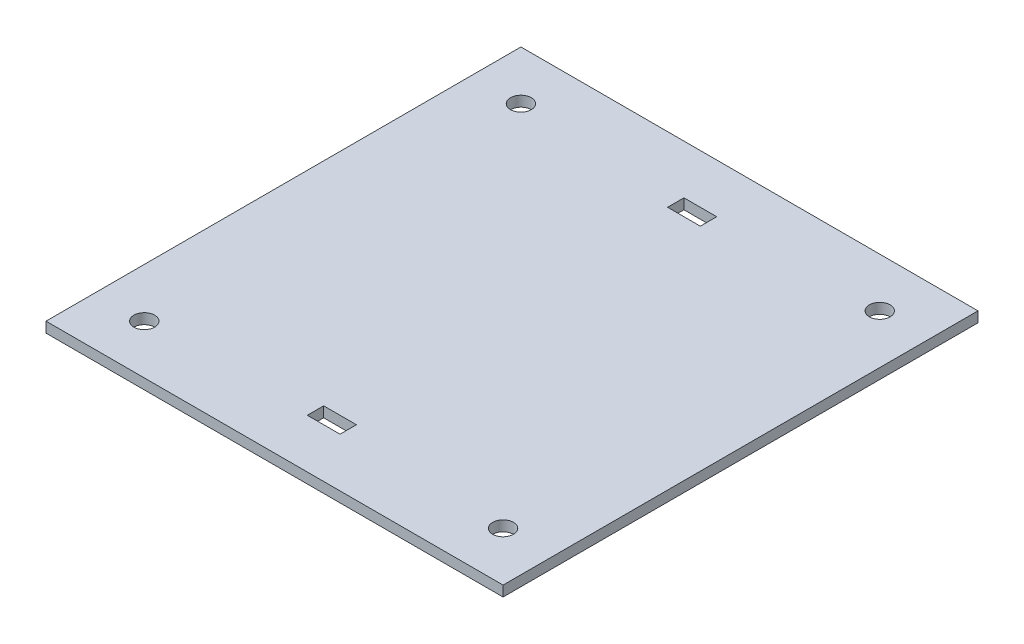
ISO-10303-21;
HEADER;
FILE_DESCRIPTION(('STEP AP214'),'2;1');
FILE_NAME('part.step','',(''),(''),'','','');
FILE_SCHEMA(('AUTOMOTIVE_DESIGN { 1 0 10303 214 1 1 1 1 }'));
ENDSEC;
DATA;
#1=APPLICATION_CONTEXT('core data for automotive mechanical design processes');
#2=APPLICATION_PROTOCOL_DEFINITION('international standard','automotive_design',2000,#1);
#3=PRODUCT_CONTEXT('',#1,'mechanical');
#4=PRODUCT('Part','Part','',(#3));
#5=PRODUCT_RELATED_PRODUCT_CATEGORY('part','',(#4));
#6=PRODUCT_DEFINITION_FORMATION('','',#4);
#7=PRODUCT_DEFINITION_CONTEXT('part definition',#1,'design');
#8=PRODUCT_DEFINITION('design','',#6,#7);
#9=PRODUCT_DEFINITION_SHAPE('','',#8);
#10=(LENGTH_UNIT() NAMED_UNIT(*) SI_UNIT(.MILLI.,.METRE.));
#11=(NAMED_UNIT(*) PLANE_ANGLE_UNIT() SI_UNIT($,.RADIAN.));
#12=(NAMED_UNIT(*) SI_UNIT($,.STERADIAN.) SOLID_ANGLE_UNIT());
#13=UNCERTAINTY_MEASURE_WITH_UNIT(LENGTH_MEASURE(1.E-05),#10,'distance_accuracy_value','');
#14=(GEOMETRIC_REPRESENTATION_CONTEXT(3) GLOBAL_UNCERTAINTY_ASSIGNED_CONTEXT((#13)) GLOBAL_UNIT_ASSIGNED_CONTEXT((#10,
#11,#12)) REPRESENTATION_CONTEXT('',''));
#15=CARTESIAN_POINT('',(0.,0.,0.));
#16=DIRECTION('',(0.,0.,1.));
#17=DIRECTION('',(1.,0.,0.));
#18=AXIS2_PLACEMENT_3D('',#15,#16,#17);
#19=CARTESIAN_POINT('',(0.,3.175,0.));
#20=DIRECTION('',(0.,1.,0.));
#21=DIRECTION('',(0.,0.,1.));
#22=AXIS2_PLACEMENT_3D('',#19,#20,#21);
#23=PLANE('',#22);
#24=CARTESIAN_POINT('',(124.55,3.175,-15.));
#25=DIRECTION('',(0.,1.,0.));
#26=DIRECTION('',(0.,0.,1.));
#27=AXIS2_PLACEMENT_3D('',#24,#25,#26);
#28=CIRCLE('',#27,3.175);
#29=CARTESIAN_POINT('',(124.55,3.175,-11.825));
#30=VERTEX_POINT('',#29);
#31=EDGE_CURVE('E271',#30,#30,#28,.T.);
#32=ORIENTED_EDGE('',*,*,#31,.F.);
#33=EDGE_LOOP('',(#32));
#34=FACE_BOUND('',#33,.T.);
#35=CARTESIAN_POINT('',(124.55,3.175,-130.));
#36=DIRECTION('',(0.,-1.,0.));
#37=DIRECTION('',(0.,0.,-1.));
#38=AXIS2_PLACEMENT_3D('',#35,#36,#37);
#39=CIRCLE('',#38,3.175);
#40=CARTESIAN_POINT('',(124.55,3.175,-133.175));
#41=VERTEX_POINT('',#40);
#42=EDGE_CURVE('E277',#41,#41,#39,.T.);
#43=ORIENTED_EDGE('',*,*,#42,.T.);
#44=EDGE_LOOP('',(#43));
#45=FACE_BOUND('',#44,.T.);
#46=DIRECTION('',(1.,0.,0.));
#47=VECTOR('',#46,1.);
#48=CARTESIAN_POINT('',(0.,3.175,0.));
#49=LINE('',#48,#47);
#50=CARTESIAN_POINT('',(0.,3.175,0.));
#51=VERTEX_POINT('',#50);
#52=CARTESIAN_POINT('',(139.55,3.175,0.));
#53=VERTEX_POINT('',#52);
#54=EDGE_CURVE('E315',#51,#53,#49,.T.);
#55=ORIENTED_EDGE('',*,*,#54,.T.);
#56=DIRECTION('',(0.,0.,-1.));
#57=VECTOR('',#56,1.);
#58=CARTESIAN_POINT('',(139.55,3.175,0.));
#59=LINE('',#58,#57);
#60=CARTESIAN_POINT('',(139.55,3.175,-145.));
#61=VERTEX_POINT('',#60);
#62=EDGE_CURVE('E318',#53,#61,#59,.T.);
#63=ORIENTED_EDGE('',*,*,#62,.T.);
#64=DIRECTION('',(1.,0.,0.));
#65=VECTOR('',#64,1.);
#66=CARTESIAN_POINT('',(0.,3.175,-145.));
#67=LINE('',#66,#65);
#68=CARTESIAN_POINT('',(0.,3.175,-145.));
#69=VERTEX_POINT('',#68);
#70=EDGE_CURVE('E321',#69,#61,#67,.T.);
#71=ORIENTED_EDGE('',*,*,#70,.F.);
#72=DIRECTION('',(0.,0.,-1.));
#73=VECTOR('',#72,1.);
#74=CARTESIAN_POINT('',(0.,3.175,0.));
#75=LINE('',#74,#73);
#76=EDGE_CURVE('E324',#51,#69,#75,.T.);
#77=ORIENTED_EDGE('',*,*,#76,.F.);
#78=EDGE_LOOP('',(#55,#63,#71,#77));
#79=FACE_BOUND('',#78,.T.);
#80=DIRECTION('',(1.,0.,0.));
#81=VECTOR('',#80,1.);
#82=CARTESIAN_POINT('',(64.775,3.175,-125.));
#83=LINE('',#82,#81);
#84=CARTESIAN_POINT('',(64.775,3.175,-125.));
#85=VERTEX_POINT('',#84);
#86=CARTESIAN_POINT('',(74.775,3.175,-125.));
#87=VERTEX_POINT('',#86);
#88=EDGE_CURVE('E285',#85,#87,#83,.T.);
#89=ORIENTED_EDGE('',*,*,#88,.F.);
#90=DIRECTION('',(0.,0.,1.));
#91=VECTOR('',#90,1.);
#92=CARTESIAN_POINT('',(64.775,3.175,-130.));
#93=LINE('',#92,#91);
#94=CARTESIAN_POINT('',(64.775,3.175,-130.));
#95=VERTEX_POINT('',#94);
#96=EDGE_CURVE('E283',#95,#85,#93,.T.);
#97=ORIENTED_EDGE('',*,*,#96,.F.);
#98=DIRECTION('',(1.,0.,0.));
#99=VECTOR('',#98,1.);
#100=CARTESIAN_POINT('',(64.775,3.175,-130.));
#101=LINE('',#100,#99);
#102=CARTESIAN_POINT('',(74.775,3.175,-130.));
#103=VERTEX_POINT('',#102);
#104=EDGE_CURVE('E291',#95,#103,#101,.T.);
#105=ORIENTED_EDGE('',*,*,#104,.T.);
#106=DIRECTION('',(0.,0.,1.));
#107=VECTOR('',#106,1.);
#108=CARTESIAN_POINT('',(74.775,3.175,-130.));
#109=LINE('',#108,#107);
#110=EDGE_CURVE('E288',#103,#87,#109,.T.);
#111=ORIENTED_EDGE('',*,*,#110,.T.);
#112=EDGE_LOOP('',(#89,#97,#105,#111));
#113=FACE_BOUND('',#112,.T.);
#114=DIRECTION('',(0.,0.,-1.));
#115=VECTOR('',#114,1.);
#116=CARTESIAN_POINT('',(64.775,3.175,-15.));
#117=LINE('',#116,#115);
#118=CARTESIAN_POINT('',(64.775,3.175,-15.));
#119=VERTEX_POINT('',#118);
#120=CARTESIAN_POINT('',(64.775,3.175,-20.));
#121=VERTEX_POINT('',#120);
#122=EDGE_CURVE('E235',#119,#121,#117,.T.);
#123=ORIENTED_EDGE('',*,*,#122,.T.);
#124=DIRECTION('',(1.,0.,0.));
#125=VECTOR('',#124,1.);
#126=CARTESIAN_POINT('',(64.775,3.175,-20.));
#127=LINE('',#126,#125);
#128=CARTESIAN_POINT('',(74.775,3.175,-20.));
#129=VERTEX_POINT('',#128);
#130=EDGE_CURVE('E241',#121,#129,#127,.T.);
#131=ORIENTED_EDGE('',*,*,#130,.T.);
#132=DIRECTION('',(0.,0.,-1.));
#133=VECTOR('',#132,1.);
#134=CARTESIAN_POINT('',(74.775,3.175,-15.));
#135=LINE('',#134,#133);
#136=CARTESIAN_POINT('',(74.775,3.175,-15.));
#137=VERTEX_POINT('',#136);
#138=EDGE_CURVE('E245',#137,#129,#135,.T.);
#139=ORIENTED_EDGE('',*,*,#138,.F.);
#140=DIRECTION('',(1.,0.,0.));
#141=VECTOR('',#140,1.);
#142=CARTESIAN_POINT('',(64.775,3.175,-15.));
#143=LINE('',#142,#141);
#144=EDGE_CURVE('E238',#119,#137,#143,.T.);
#145=ORIENTED_EDGE('',*,*,#144,.F.);
#146=EDGE_LOOP('',(#123,#131,#139,#145));
#147=FACE_BOUND('',#146,.T.);
#148=CARTESIAN_POINT('',(15.,3.175,-15.));
#149=DIRECTION('',(0.,-1.,0.));
#150=DIRECTION('',(0.,0.,-1.));
#151=AXIS2_PLACEMENT_3D('',#148,#149,#150);
#152=CIRCLE('',#151,3.175);
#153=CARTESIAN_POINT('',(15.,3.175,-18.175));
#154=VERTEX_POINT('',#153);
#155=EDGE_CURVE('E261',#154,#154,#152,.T.);
#156=ORIENTED_EDGE('',*,*,#155,.T.);
#157=EDGE_LOOP('',(#156));
#158=FACE_BOUND('',#157,.T.);
#159=CARTESIAN_POINT('',(15.,3.175,-130.));
#160=DIRECTION('',(0.,1.,0.));
#161=DIRECTION('',(0.,0.,1.));
#162=AXIS2_PLACEMENT_3D('',#159,#160,#161);
#163=CIRCLE('',#162,3.175);
#164=CARTESIAN_POINT('',(15.,3.175,-126.825));
#165=VERTEX_POINT('',#164);
#166=EDGE_CURVE('E529',#165,#165,#163,.T.);
#167=ORIENTED_EDGE('',*,*,#166,.F.);
#168=EDGE_LOOP('',(#167));
#169=FACE_BOUND('',#168,.T.);
#170=ADVANCED_FACE('F144',(#34,#45,#79,#113,#147,#158,#169),#23,.T.);
#171=CARTESIAN_POINT('',(0.,0.,0.));
#172=DIRECTION('',(0.,1.,0.));
#173=DIRECTION('',(0.,0.,1.));
#174=AXIS2_PLACEMENT_3D('',#171,#172,#173);
#175=PLANE('',#174);
#176=CARTESIAN_POINT('',(15.,0.,-15.));
#177=DIRECTION('',(0.,-1.,0.));
#178=DIRECTION('',(0.,0.,-1.));
#179=AXIS2_PLACEMENT_3D('',#176,#177,#178);
#180=CIRCLE('',#179,3.175);
#181=CARTESIAN_POINT('',(15.,0.,-18.175));
#182=VERTEX_POINT('',#181);
#183=EDGE_CURVE('E254',#182,#182,#180,.T.);
#184=ORIENTED_EDGE('',*,*,#183,.F.);
#185=EDGE_LOOP('',(#184));
#186=FACE_BOUND('',#185,.T.);
#187=DIRECTION('',(1.,0.,0.));
#188=VECTOR('',#187,1.);
#189=CARTESIAN_POINT('',(64.775,0.,-20.));
#190=LINE('',#189,#188);
#191=CARTESIAN_POINT('',(64.775,0.,-20.));
#192=VERTEX_POINT('',#191);
#193=CARTESIAN_POINT('',(74.775,0.,-20.));
#194=VERTEX_POINT('',#193);
#195=EDGE_CURVE('E260',#192,#194,#190,.T.);
#196=ORIENTED_EDGE('',*,*,#195,.F.);
#197=DIRECTION('',(0.,0.,-1.));
#198=VECTOR('',#197,1.);
#199=CARTESIAN_POINT('',(64.775,0.,-15.));
#200=LINE('',#199,#198);
#201=CARTESIAN_POINT('',(64.775,0.,-15.));
#202=VERTEX_POINT('',#201);
#203=EDGE_CURVE('E167',#202,#192,#200,.T.);
#204=ORIENTED_EDGE('',*,*,#203,.F.);
#205=DIRECTION('',(1.,0.,0.));
#206=VECTOR('',#205,1.);
#207=CARTESIAN_POINT('',(64.775,0.,-15.));
#208=LINE('',#207,#206);
#209=CARTESIAN_POINT('',(74.775,0.,-15.));
#210=VERTEX_POINT('',#209);
#211=EDGE_CURVE('E248',#202,#210,#208,.T.);
#212=ORIENTED_EDGE('',*,*,#211,.T.);
#213=DIRECTION('',(0.,0.,-1.));
#214=VECTOR('',#213,1.);
#215=CARTESIAN_POINT('',(74.775,0.,-15.));
#216=LINE('',#215,#214);
#217=EDGE_CURVE('E251',#210,#194,#216,.T.);
#218=ORIENTED_EDGE('',*,*,#217,.T.);
#219=EDGE_LOOP('',(#196,#204,#212,#218));
#220=FACE_BOUND('',#219,.T.);
#221=CARTESIAN_POINT('',(124.55,0.,-130.));
#222=DIRECTION('',(0.,-1.,0.));
#223=DIRECTION('',(0.,0.,-1.));
#224=AXIS2_PLACEMENT_3D('',#221,#222,#223);
#225=CIRCLE('',#224,3.175);
#226=CARTESIAN_POINT('',(124.55,0.,-133.175));
#227=VERTEX_POINT('',#226);
#228=EDGE_CURVE('E274',#227,#227,#225,.T.);
#229=ORIENTED_EDGE('',*,*,#228,.F.);
#230=EDGE_LOOP('',(#229));
#231=FACE_BOUND('',#230,.T.);
#232=DIRECTION('',(1.,0.,0.));
#233=VECTOR('',#232,1.);
#234=CARTESIAN_POINT('',(0.,0.,0.));
#235=LINE('',#234,#233);
#236=CARTESIAN_POINT('',(0.,0.,0.));
#237=VERTEX_POINT('',#236);
#238=CARTESIAN_POINT('',(139.55,0.,0.));
#239=VERTEX_POINT('',#238);
#240=EDGE_CURVE('E314',#237,#239,#235,.T.);
#241=ORIENTED_EDGE('',*,*,#240,.F.);
#242=DIRECTION('',(0.,0.,-1.));
#243=VECTOR('',#242,1.);
#244=CARTESIAN_POINT('',(0.,0.,0.));
#245=LINE('',#244,#243);
#246=CARTESIAN_POINT('',(0.,0.,-145.));
#247=VERTEX_POINT('',#246);
#248=EDGE_CURVE('E319',#237,#247,#245,.T.);
#249=ORIENTED_EDGE('',*,*,#248,.T.);
#250=DIRECTION('',(1.,0.,0.));
#251=VECTOR('',#250,1.);
#252=CARTESIAN_POINT('',(0.,0.,-145.));
#253=LINE('',#252,#251);
#254=CARTESIAN_POINT('',(139.55,0.,-145.));
#255=VERTEX_POINT('',#254);
#256=EDGE_CURVE('E333',#247,#255,#253,.T.);
#257=ORIENTED_EDGE('',*,*,#256,.T.);
#258=DIRECTION('',(0.,0.,-1.));
#259=VECTOR('',#258,1.);
#260=CARTESIAN_POINT('',(139.55,0.,0.));
#261=LINE('',#260,#259);
#262=EDGE_CURVE('E330',#239,#255,#261,.T.);
#263=ORIENTED_EDGE('',*,*,#262,.F.);
#264=EDGE_LOOP('',(#241,#249,#257,#263));
#265=FACE_BOUND('',#264,.T.);
#266=DIRECTION('',(0.,0.,1.));
#267=VECTOR('',#266,1.);
#268=CARTESIAN_POINT('',(64.775,0.,-130.));
#269=LINE('',#268,#267);
#270=CARTESIAN_POINT('',(64.775,0.,-130.));
#271=VERTEX_POINT('',#270);
#272=CARTESIAN_POINT('',(64.775,0.,-125.));
#273=VERTEX_POINT('',#272);
#274=EDGE_CURVE('E280',#271,#273,#269,.T.);
#275=ORIENTED_EDGE('',*,*,#274,.T.);
#276=DIRECTION('',(1.,0.,0.));
#277=VECTOR('',#276,1.);
#278=CARTESIAN_POINT('',(64.775,0.,-125.));
#279=LINE('',#278,#277);
#280=CARTESIAN_POINT('',(74.775,0.,-125.));
#281=VERTEX_POINT('',#280);
#282=EDGE_CURVE('E297',#273,#281,#279,.T.);
#283=ORIENTED_EDGE('',*,*,#282,.T.);
#284=DIRECTION('',(0.,0.,1.));
#285=VECTOR('',#284,1.);
#286=CARTESIAN_POINT('',(74.775,0.,-130.));
#287=LINE('',#286,#285);
#288=CARTESIAN_POINT('',(74.775,0.,-130.));
#289=VERTEX_POINT('',#288);
#290=EDGE_CURVE('E300',#289,#281,#287,.T.);
#291=ORIENTED_EDGE('',*,*,#290,.F.);
#292=DIRECTION('',(1.,0.,0.));
#293=VECTOR('',#292,1.);
#294=CARTESIAN_POINT('',(64.775,0.,-130.));
#295=LINE('',#294,#293);
#296=EDGE_CURVE('E286',#271,#289,#295,.T.);
#297=ORIENTED_EDGE('',*,*,#296,.F.);
#298=EDGE_LOOP('',(#275,#283,#291,#297));
#299=FACE_BOUND('',#298,.T.);
#300=CARTESIAN_POINT('',(124.55,0.,-15.));
#301=DIRECTION('',(0.,1.,0.));
#302=DIRECTION('',(0.,0.,1.));
#303=AXIS2_PLACEMENT_3D('',#300,#301,#302);
#304=CIRCLE('',#303,3.175);
#305=CARTESIAN_POINT('',(124.55,0.,-11.825));
#306=VERTEX_POINT('',#305);
#307=EDGE_CURVE('E267',#306,#306,#304,.T.);
#308=ORIENTED_EDGE('',*,*,#307,.T.);
#309=EDGE_LOOP('',(#308));
#310=FACE_BOUND('',#309,.T.);
#311=CARTESIAN_POINT('',(15.,0.,-130.));
#312=DIRECTION('',(0.,1.,0.));
#313=DIRECTION('',(0.,0.,1.));
#314=AXIS2_PLACEMENT_3D('',#311,#312,#313);
#315=CIRCLE('',#314,3.175);
#316=CARTESIAN_POINT('',(15.,0.,-126.825));
#317=VERTEX_POINT('',#316);
#318=EDGE_CURVE('E532',#317,#317,#315,.T.);
#319=ORIENTED_EDGE('',*,*,#318,.T.);
#320=EDGE_LOOP('',(#319));
#321=FACE_BOUND('',#320,.T.);
#322=ADVANCED_FACE('F350',(#186,#220,#231,#265,#299,#310,#321),#175,.F.);
#323=CARTESIAN_POINT('',(0.,3.175,0.));
#324=DIRECTION('',(0.,0.,-1.));
#325=DIRECTION('',(-1.,0.,0.));
#326=AXIS2_PLACEMENT_3D('',#323,#324,#325);
#327=PLANE('',#326);
#328=ORIENTED_EDGE('',*,*,#240,.T.);
#329=DIRECTION('',(0.,-1.,0.));
#330=VECTOR('',#329,1.);
#331=CARTESIAN_POINT('',(139.55,3.175,0.));
#332=LINE('',#331,#330);
#333=EDGE_CURVE('E12',#53,#239,#332,.T.);
#334=ORIENTED_EDGE('',*,*,#333,.F.);
#335=ORIENTED_EDGE('',*,*,#54,.F.);
#336=DIRECTION('',(0.,-1.,0.));
#337=VECTOR('',#336,1.);
#338=CARTESIAN_POINT('',(0.,3.175,0.));
#339=LINE('',#338,#337);
#340=EDGE_CURVE('E327',#51,#237,#339,.T.);
#341=ORIENTED_EDGE('',*,*,#340,.T.);
#342=EDGE_LOOP('',(#328,#334,#335,#341));
#343=FACE_BOUND('',#342,.T.);
#344=ADVANCED_FACE('F146',(#343),#327,.F.);
#345=CARTESIAN_POINT('',(139.55,3.175,0.));
#346=DIRECTION('',(-1.,0.,0.));
#347=DIRECTION('',(0.,0.,1.));
#348=AXIS2_PLACEMENT_3D('',#345,#346,#347);
#349=PLANE('',#348);
#350=ORIENTED_EDGE('',*,*,#262,.T.);
#351=DIRECTION('',(0.,-1.,0.));
#352=VECTOR('',#351,1.);
#353=CARTESIAN_POINT('',(139.55,3.175,-145.));
#354=LINE('',#353,#352);
#355=EDGE_CURVE('E152',#61,#255,#354,.T.);
#356=ORIENTED_EDGE('',*,*,#355,.F.);
#357=ORIENTED_EDGE('',*,*,#62,.F.);
#358=ORIENTED_EDGE('',*,*,#333,.T.);
#359=EDGE_LOOP('',(#350,#356,#357,#358));
#360=FACE_BOUND('',#359,.T.);
#361=ADVANCED_FACE('F346',(#360),#349,.F.);
#362=CARTESIAN_POINT('',(0.,3.175,-145.));
#363=DIRECTION('',(0.,0.,-1.));
#364=DIRECTION('',(-1.,0.,0.));
#365=AXIS2_PLACEMENT_3D('',#362,#363,#364);
#366=PLANE('',#365);
#367=ORIENTED_EDGE('',*,*,#256,.F.);
#368=DIRECTION('',(0.,-1.,0.));
#369=VECTOR('',#368,1.);
#370=CARTESIAN_POINT('',(0.,3.175,-145.));
#371=LINE('',#370,#369);
#372=EDGE_CURVE('E339',#69,#247,#371,.T.);
#373=ORIENTED_EDGE('',*,*,#372,.F.);
#374=ORIENTED_EDGE('',*,*,#70,.T.);
#375=ORIENTED_EDGE('',*,*,#355,.T.);
#376=EDGE_LOOP('',(#367,#373,#374,#375));
#377=FACE_BOUND('',#376,.T.);
#378=ADVANCED_FACE('F343',(#377),#366,.T.);
#379=CARTESIAN_POINT('',(0.,3.175,0.));
#380=DIRECTION('',(-1.,0.,0.));
#381=DIRECTION('',(0.,0.,1.));
#382=AXIS2_PLACEMENT_3D('',#379,#380,#381);
#383=PLANE('',#382);
#384=ORIENTED_EDGE('',*,*,#248,.F.);
#385=ORIENTED_EDGE('',*,*,#340,.F.);
#386=ORIENTED_EDGE('',*,*,#76,.T.);
#387=ORIENTED_EDGE('',*,*,#372,.T.);
#388=EDGE_LOOP('',(#384,#385,#386,#387));
#389=FACE_BOUND('',#388,.T.);
#390=ADVANCED_FACE('F354',(#389),#383,.T.);
#391=CARTESIAN_POINT('',(64.775,3.175,-130.));
#392=DIRECTION('',(1.,0.,0.));
#393=DIRECTION('',(0.,0.,-1.));
#394=AXIS2_PLACEMENT_3D('',#391,#392,#393);
#395=PLANE('',#394);
#396=ORIENTED_EDGE('',*,*,#274,.F.);
#397=DIRECTION('',(0.,-1.,0.));
#398=VECTOR('',#397,1.);
#399=CARTESIAN_POINT('',(64.775,3.175,-130.));
#400=LINE('',#399,#398);
#401=EDGE_CURVE('E294',#95,#271,#400,.T.);
#402=ORIENTED_EDGE('',*,*,#401,.F.);
#403=ORIENTED_EDGE('',*,*,#96,.T.);
#404=DIRECTION('',(0.,-1.,0.));
#405=VECTOR('',#404,1.);
#406=CARTESIAN_POINT('',(64.775,3.175,-125.));
#407=LINE('',#406,#405);
#408=EDGE_CURVE('E311',#85,#273,#407,.T.);
#409=ORIENTED_EDGE('',*,*,#408,.T.);
#410=EDGE_LOOP('',(#396,#402,#403,#409));
#411=FACE_BOUND('',#410,.T.);
#412=ADVANCED_FACE('F375',(#411),#395,.T.);
#413=CARTESIAN_POINT('',(64.775,3.175,-125.));
#414=DIRECTION('',(0.,0.,-1.));
#415=DIRECTION('',(-1.,0.,0.));
#416=AXIS2_PLACEMENT_3D('',#413,#414,#415);
#417=PLANE('',#416);
#418=ORIENTED_EDGE('',*,*,#282,.F.);
#419=ORIENTED_EDGE('',*,*,#408,.F.);
#420=ORIENTED_EDGE('',*,*,#88,.T.);
#421=DIRECTION('',(0.,-1.,0.));
#422=VECTOR('',#421,1.);
#423=CARTESIAN_POINT('',(74.775,3.175,-125.));
#424=LINE('',#423,#422);
#425=EDGE_CURVE('E309',#87,#281,#424,.T.);
#426=ORIENTED_EDGE('',*,*,#425,.T.);
#427=EDGE_LOOP('',(#418,#419,#420,#426));
#428=FACE_BOUND('',#427,.T.);
#429=ADVANCED_FACE('F395',(#428),#417,.T.);
#430=CARTESIAN_POINT('',(74.775,3.175,-130.));
#431=DIRECTION('',(1.,0.,0.));
#432=DIRECTION('',(0.,0.,-1.));
#433=AXIS2_PLACEMENT_3D('',#430,#431,#432);
#434=PLANE('',#433);
#435=ORIENTED_EDGE('',*,*,#290,.T.);
#436=ORIENTED_EDGE('',*,*,#425,.F.);
#437=ORIENTED_EDGE('',*,*,#110,.F.);
#438=DIRECTION('',(0.,-1.,0.));
#439=VECTOR('',#438,1.);
#440=CARTESIAN_POINT('',(74.775,3.175,-130.));
#441=LINE('',#440,#439);
#442=EDGE_CURVE('E307',#103,#289,#441,.T.);
#443=ORIENTED_EDGE('',*,*,#442,.T.);
#444=EDGE_LOOP('',(#435,#436,#437,#443));
#445=FACE_BOUND('',#444,.T.);
#446=ADVANCED_FACE('F402',(#445),#434,.F.);
#447=CARTESIAN_POINT('',(64.775,3.175,-130.));
#448=DIRECTION('',(0.,0.,-1.));
#449=DIRECTION('',(-1.,0.,0.));
#450=AXIS2_PLACEMENT_3D('',#447,#448,#449);
#451=PLANE('',#450);
#452=ORIENTED_EDGE('',*,*,#296,.T.);
#453=ORIENTED_EDGE('',*,*,#442,.F.);
#454=ORIENTED_EDGE('',*,*,#104,.F.);
#455=ORIENTED_EDGE('',*,*,#401,.T.);
#456=EDGE_LOOP('',(#452,#453,#454,#455));
#457=FACE_BOUND('',#456,.T.);
#458=ADVANCED_FACE('F409',(#457),#451,.F.);
#459=CARTESIAN_POINT('',(124.55,3.175,-130.));
#460=DIRECTION('',(0.,-1.,0.));
#461=DIRECTION('',(0.,0.,-1.));
#462=AXIS2_PLACEMENT_3D('',#459,#460,#461);
#463=CYLINDRICAL_SURFACE('',#462,3.175);
#464=ORIENTED_EDGE('',*,*,#42,.F.);
#465=EDGE_LOOP('',(#464));
#466=FACE_BOUND('',#465,.T.);
#467=ORIENTED_EDGE('',*,*,#228,.T.);
#468=EDGE_LOOP('',(#467));
#469=FACE_BOUND('',#468,.T.);
#470=ADVANCED_FACE('F417',(#466,#469),#463,.F.);
#471=CARTESIAN_POINT('',(124.55,3.175,-15.));
#472=DIRECTION('',(0.,-1.,0.));
#473=DIRECTION('',(0.,0.,-1.));
#474=AXIS2_PLACEMENT_3D('',#471,#472,#473);
#475=CYLINDRICAL_SURFACE('',#474,3.175);
#476=ORIENTED_EDGE('',*,*,#31,.T.);
#477=EDGE_LOOP('',(#476));
#478=FACE_BOUND('',#477,.T.);
#479=ORIENTED_EDGE('',*,*,#307,.F.);
#480=EDGE_LOOP('',(#479));
#481=FACE_BOUND('',#480,.T.);
#482=ADVANCED_FACE('F425',(#478,#481),#475,.F.);
#483=CARTESIAN_POINT('',(64.775,3.175,-15.));
#484=DIRECTION('',(-1.,0.,0.));
#485=DIRECTION('',(0.,0.,1.));
#486=AXIS2_PLACEMENT_3D('',#483,#484,#485);
#487=PLANE('',#486);
#488=ORIENTED_EDGE('',*,*,#203,.T.);
#489=DIRECTION('',(0.,-1.,0.));
#490=VECTOR('',#489,1.);
#491=CARTESIAN_POINT('',(64.775,3.175,-20.));
#492=LINE('',#491,#490);
#493=EDGE_CURVE('E232',#121,#192,#492,.T.);
#494=ORIENTED_EDGE('',*,*,#493,.F.);
#495=ORIENTED_EDGE('',*,*,#122,.F.);
#496=DIRECTION('',(0.,-1.,0.));
#497=VECTOR('',#496,1.);
#498=CARTESIAN_POINT('',(64.775,3.175,-15.));
#499=LINE('',#498,#497);
#500=EDGE_CURVE('E265',#119,#202,#499,.T.);
#501=ORIENTED_EDGE('',*,*,#500,.T.);
#502=EDGE_LOOP('',(#488,#494,#495,#501));
#503=FACE_BOUND('',#502,.T.);
#504=ADVANCED_FACE('F233',(#503),#487,.F.);
#505=CARTESIAN_POINT('',(64.775,3.175,-15.));
#506=DIRECTION('',(0.,0.,-1.));
#507=DIRECTION('',(-1.,0.,0.));
#508=AXIS2_PLACEMENT_3D('',#505,#506,#507);
#509=PLANE('',#508);
#510=ORIENTED_EDGE('',*,*,#211,.F.);
#511=ORIENTED_EDGE('',*,*,#500,.F.);
#512=ORIENTED_EDGE('',*,*,#144,.T.);
#513=DIRECTION('',(0.,-1.,0.));
#514=VECTOR('',#513,1.);
#515=CARTESIAN_POINT('',(74.775,3.175,-15.));
#516=LINE('',#515,#514);
#517=EDGE_CURVE('E268',#137,#210,#516,.T.);
#518=ORIENTED_EDGE('',*,*,#517,.T.);
#519=EDGE_LOOP('',(#510,#511,#512,#518));
#520=FACE_BOUND('',#519,.T.);
#521=ADVANCED_FACE('F440',(#520),#509,.T.);
#522=CARTESIAN_POINT('',(74.775,3.175,-15.));
#523=DIRECTION('',(-1.,0.,0.));
#524=DIRECTION('',(0.,0.,1.));
#525=AXIS2_PLACEMENT_3D('',#522,#523,#524);
#526=PLANE('',#525);
#527=ORIENTED_EDGE('',*,*,#217,.F.);
#528=ORIENTED_EDGE('',*,*,#517,.F.);
#529=ORIENTED_EDGE('',*,*,#138,.T.);
#530=DIRECTION('',(0.,-1.,0.));
#531=VECTOR('',#530,1.);
#532=CARTESIAN_POINT('',(74.775,3.175,-20.));
#533=LINE('',#532,#531);
#534=EDGE_CURVE('E159',#129,#194,#533,.T.);
#535=ORIENTED_EDGE('',*,*,#534,.T.);
#536=EDGE_LOOP('',(#527,#528,#529,#535));
#537=FACE_BOUND('',#536,.T.);
#538=ADVANCED_FACE('F447',(#537),#526,.T.);
#539=CARTESIAN_POINT('',(64.775,3.175,-20.));
#540=DIRECTION('',(0.,0.,-1.));
#541=DIRECTION('',(-1.,0.,0.));
#542=AXIS2_PLACEMENT_3D('',#539,#540,#541);
#543=PLANE('',#542);
#544=ORIENTED_EDGE('',*,*,#195,.T.);
#545=ORIENTED_EDGE('',*,*,#534,.F.);
#546=ORIENTED_EDGE('',*,*,#130,.F.);
#547=ORIENTED_EDGE('',*,*,#493,.T.);
#548=EDGE_LOOP('',(#544,#545,#546,#547));
#549=FACE_BOUND('',#548,.T.);
#550=ADVANCED_FACE('F242',(#549),#543,.F.);
#551=CARTESIAN_POINT('',(15.,3.175,-15.));
#552=DIRECTION('',(0.,-1.,0.));
#553=DIRECTION('',(0.,0.,-1.));
#554=AXIS2_PLACEMENT_3D('',#551,#552,#553);
#555=CYLINDRICAL_SURFACE('',#554,3.175);
#556=ORIENTED_EDGE('',*,*,#155,.F.);
#557=EDGE_LOOP('',(#556));
#558=FACE_BOUND('',#557,.T.);
#559=ORIENTED_EDGE('',*,*,#183,.T.);
#560=EDGE_LOOP('',(#559));
#561=FACE_BOUND('',#560,.T.);
#562=ADVANCED_FACE('F462',(#558,#561),#555,.F.);
#563=CARTESIAN_POINT('',(15.,3.175,-130.));
#564=DIRECTION('',(0.,-1.,0.));
#565=DIRECTION('',(0.,0.,-1.));
#566=AXIS2_PLACEMENT_3D('',#563,#564,#565);
#567=CYLINDRICAL_SURFACE('',#566,3.175);
#568=ORIENTED_EDGE('',*,*,#166,.T.);
#569=EDGE_LOOP('',(#568));
#570=FACE_BOUND('',#569,.T.);
#571=ORIENTED_EDGE('',*,*,#318,.F.);
#572=EDGE_LOOP('',(#571));
#573=FACE_BOUND('',#572,.T.);
#574=ADVANCED_FACE('F469',(#570,#573),#567,.F.);
#575=CLOSED_SHELL('',(#170,#322,#344,#361,#378,#390,#412,#429,#446,#458,#470,#482,#504,#521,
#538,#550,#562,#574));
#576=MANIFOLD_SOLID_BREP('B2',#575);
#577=ADVANCED_BREP_SHAPE_REPRESENTATION('',(#18,#576),#14);
#578=SHAPE_DEFINITION_REPRESENTATION(#9,#577);
ENDSEC;
END-ISO-10303-21;
